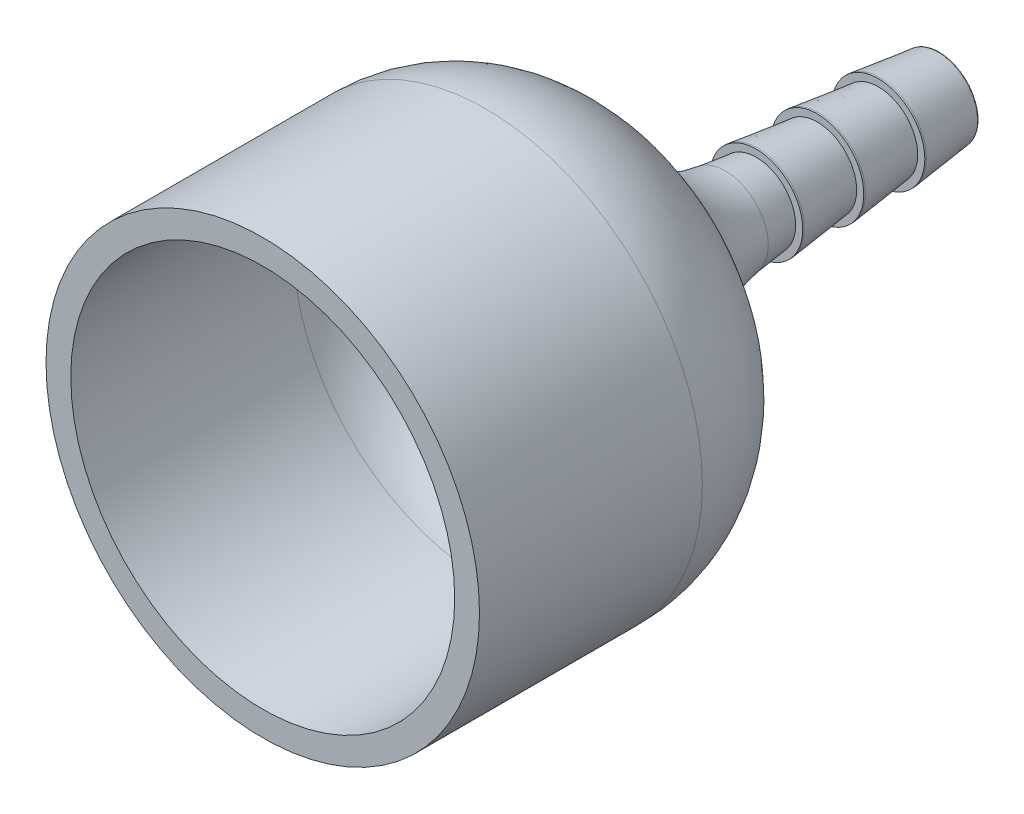
ISO-10303-21;
HEADER;
FILE_DESCRIPTION(('STEP AP214'),'2;1');
FILE_NAME('part.step','',(''),(''),'','','');
FILE_SCHEMA(('AUTOMOTIVE_DESIGN { 1 0 10303 214 1 1 1 1 }'));
ENDSEC;
DATA;
#1=APPLICATION_CONTEXT('core data for automotive mechanical design processes');
#2=APPLICATION_PROTOCOL_DEFINITION('international standard','automotive_design',2000,#1);
#3=PRODUCT_CONTEXT('',#1,'mechanical');
#4=PRODUCT('Part','Part','',(#3));
#5=PRODUCT_RELATED_PRODUCT_CATEGORY('part','',(#4));
#6=PRODUCT_DEFINITION_FORMATION('','',#4);
#7=PRODUCT_DEFINITION_CONTEXT('part definition',#1,'design');
#8=PRODUCT_DEFINITION('design','',#6,#7);
#9=PRODUCT_DEFINITION_SHAPE('','',#8);
#10=(LENGTH_UNIT() NAMED_UNIT(*) SI_UNIT(.MILLI.,.METRE.));
#11=(NAMED_UNIT(*) PLANE_ANGLE_UNIT() SI_UNIT($,.RADIAN.));
#12=(NAMED_UNIT(*) SI_UNIT($,.STERADIAN.) SOLID_ANGLE_UNIT());
#13=UNCERTAINTY_MEASURE_WITH_UNIT(LENGTH_MEASURE(1.E-05),#10,'distance_accuracy_value','');
#14=(GEOMETRIC_REPRESENTATION_CONTEXT(3) GLOBAL_UNCERTAINTY_ASSIGNED_CONTEXT((#13)) GLOBAL_UNIT_ASSIGNED_CONTEXT((#10,
#11,#12)) REPRESENTATION_CONTEXT('',''));
#15=CARTESIAN_POINT('',(0.,0.,0.));
#16=DIRECTION('',(0.,0.,1.));
#17=DIRECTION('',(1.,0.,0.));
#18=AXIS2_PLACEMENT_3D('',#15,#16,#17);
#19=CARTESIAN_POINT('',(0.,0.,-20.7304));
#20=DIRECTION('',(0.,0.,1.));
#21=DIRECTION('',(1.,0.,0.));
#22=AXIS2_PLACEMENT_3D('',#19,#20,#21);
#23=CONICAL_SURFACE('',#22,3.748185925,0.118542781631952);
#24=CARTESIAN_POINT('',(0.,0.,-25.4190130370028));
#25=DIRECTION('',(0.,0.,1.));
#26=DIRECTION('',(1.,0.,0.));
#27=AXIS2_PLACEMENT_3D('',#24,#25,#26);
#28=CIRCLE('',#27,3.18976653061079);
#29=CARTESIAN_POINT('',(3.18976653061079,0.,-25.4190130370028));
#30=VERTEX_POINT('',#29);
#31=EDGE_CURVE('E59',#30,#30,#28,.T.);
#32=ORIENTED_EDGE('',*,*,#31,.T.);
#33=EDGE_LOOP('',(#32));
#34=FACE_BOUND('',#33,.T.);
#35=CARTESIAN_POINT('',(0.,0.,-20.7304));
#36=DIRECTION('',(0.,0.,1.));
#37=DIRECTION('',(1.,0.,0.));
#38=AXIS2_PLACEMENT_3D('',#35,#36,#37);
#39=CIRCLE('',#38,3.748185925);
#40=CARTESIAN_POINT('',(3.748185925,0.,-20.7304));
#41=VERTEX_POINT('',#40);
#42=EDGE_CURVE('E107',#41,#41,#39,.T.);
#43=ORIENTED_EDGE('',*,*,#42,.F.);
#44=EDGE_LOOP('',(#43));
#45=FACE_BOUND('',#44,.T.);
#46=ADVANCED_FACE('F39',(#34,#45),#23,.T.);
#47=CARTESIAN_POINT('',(3.18976653061074,0.,-25.4190130370028));
#48=CARTESIAN_POINT('',(3.18636645890866,0.,-25.4475607928099));
#49=CARTESIAN_POINT('',(3.171391458103,0.,-25.4785311625513));
#50=CARTESIAN_POINT('',(3.12290905073233,0.,-25.5208290056172));
#51=CARTESIAN_POINT('',(3.09109606153185,0.,-25.531));
#52=CARTESIAN_POINT('',(3.06360027050815,0.,-25.531));
#53=B_SPLINE_CURVE_WITH_KNOTS('',3,(#47,#48,#49,#50,#51,#52),.UNSPECIFIED.,.F.,.F.,(4,2,4),(0.,
0.5,1.),.UNSPECIFIED.);
#54=CARTESIAN_POINT('',(0.,0.,-25.781));
#55=DIRECTION('',(0.,0.,1.));
#56=AXIS1_PLACEMENT('',#54,#55);
#57=SURFACE_OF_REVOLUTION('',#53,#56);
#58=CARTESIAN_POINT('',(0.,0.,-25.531));
#59=DIRECTION('',(0.,0.,1.));
#60=DIRECTION('',(1.,0.,0.));
#61=AXIS2_PLACEMENT_3D('',#58,#59,#60);
#62=CIRCLE('',#61,3.06360027050815);
#63=CARTESIAN_POINT('',(3.06360027050815,0.,-25.531));
#64=VERTEX_POINT('',#63);
#65=EDGE_CURVE('E62',#64,#64,#62,.T.);
#66=ORIENTED_EDGE('',*,*,#65,.T.);
#67=EDGE_LOOP('',(#66));
#68=FACE_BOUND('',#67,.T.);
#69=ORIENTED_EDGE('',*,*,#31,.F.);
#70=EDGE_LOOP('',(#69));
#71=FACE_BOUND('',#70,.T.);
#72=ADVANCED_FACE('F117',(#68,#71),#57,.F.);
#73=CARTESIAN_POINT('',(1.08726742428337E-13,0.,-25.531));
#74=DIRECTION('',(0.,0.,-1.));
#75=DIRECTION('',(-1.,0.,0.));
#76=AXIS2_PLACEMENT_3D('',#73,#74,#75);
#77=PLANE('',#76);
#78=CARTESIAN_POINT('',(0.,0.,-25.531));
#79=DIRECTION('',(0.,0.,1.));
#80=DIRECTION('',(1.,0.,0.));
#81=AXIS2_PLACEMENT_3D('',#78,#79,#80);
#82=CIRCLE('',#81,2.248911555);
#83=CARTESIAN_POINT('',(2.248911555,0.,-25.531));
#84=VERTEX_POINT('',#83);
#85=EDGE_CURVE('E65',#84,#84,#82,.T.);
#86=ORIENTED_EDGE('',*,*,#85,.T.);
#87=EDGE_LOOP('',(#86));
#88=FACE_BOUND('',#87,.T.);
#89=ORIENTED_EDGE('',*,*,#65,.F.);
#90=EDGE_LOOP('',(#89));
#91=FACE_BOUND('',#90,.T.);
#92=ADVANCED_FACE('F121',(#88,#91),#77,.T.);
#93=CARTESIAN_POINT('',(0.,0.,-25.781));
#94=DIRECTION('',(0.,0.,1.));
#95=DIRECTION('',(1.,0.,0.));
#96=AXIS2_PLACEMENT_3D('',#93,#94,#95);
#97=CYLINDRICAL_SURFACE('',#96,2.248911555);
#98=CARTESIAN_POINT('',(0.,0.,0.106999999999999));
#99=DIRECTION('',(0.,0.,1.));
#100=DIRECTION('',(1.,0.,0.));
#101=AXIS2_PLACEMENT_3D('',#98,#99,#100);
#102=CIRCLE('',#101,2.248911555);
#103=CARTESIAN_POINT('',(2.248911555,0.,0.106999999999999));
#104=VERTEX_POINT('',#103);
#105=EDGE_CURVE('E46',#104,#104,#102,.T.);
#106=ORIENTED_EDGE('',*,*,#105,.T.);
#107=EDGE_LOOP('',(#106));
#108=FACE_BOUND('',#107,.T.);
#109=ORIENTED_EDGE('',*,*,#85,.F.);
#110=EDGE_LOOP('',(#109));
#111=FACE_BOUND('',#110,.T.);
#112=ADVANCED_FACE('F172',(#108,#111),#97,.F.);
#113=CARTESIAN_POINT('',(0.,0.,1.107));
#114=DIRECTION('',(0.,0.,1.));
#115=DIRECTION('',(1.,0.,0.));
#116=AXIS2_PLACEMENT_3D('',#113,#114,#115);
#117=PLANE('',#116);
#118=CARTESIAN_POINT('',(0.,0.,1.107));
#119=DIRECTION('',(0.,0.,1.));
#120=DIRECTION('',(1.,0.,0.));
#121=AXIS2_PLACEMENT_3D('',#118,#119,#120);
#122=CIRCLE('',#121,3.248911555);
#123=CARTESIAN_POINT('',(3.248911555,0.,1.107));
#124=VERTEX_POINT('',#123);
#125=EDGE_CURVE('E10',#124,#124,#122,.F.);
#126=ORIENTED_EDGE('',*,*,#125,.T.);
#127=EDGE_LOOP('',(#126));
#128=FACE_BOUND('',#127,.T.);
#129=CARTESIAN_POINT('',(0.,0.,1.107));
#130=DIRECTION('',(0.,0.,1.));
#131=DIRECTION('',(1.,0.,0.));
#132=AXIS2_PLACEMENT_3D('',#129,#130,#131);
#133=CIRCLE('',#132,5.5);
#134=CARTESIAN_POINT('',(5.5,0.,1.107));
#135=VERTEX_POINT('',#134);
#136=EDGE_CURVE('E68',#135,#135,#133,.T.);
#137=ORIENTED_EDGE('',*,*,#136,.T.);
#138=EDGE_LOOP('',(#137));
#139=FACE_BOUND('',#138,.T.);
#140=ADVANCED_FACE('F169',(#128,#139),#117,.T.);
#141=CARTESIAN_POINT('',(0.,0.,11.107));
#142=DIRECTION('',(0.,0.,1.));
#143=DIRECTION('',(1.,0.,0.));
#144=AXIS2_PLACEMENT_3D('',#141,#142,#143);
#145=DEGENERATE_TOROIDAL_SURFACE('',#144,5.5,10.,.T.);
#146=CARTESIAN_POINT('',(0.,0.,11.107));
#147=DIRECTION('',(0.,0.,1.));
#148=DIRECTION('',(1.,0.,0.));
#149=AXIS2_PLACEMENT_3D('',#146,#147,#148);
#150=CIRCLE('',#149,15.5);
#151=CARTESIAN_POINT('',(15.5,0.,11.107));
#152=VERTEX_POINT('',#151);
#153=EDGE_CURVE('E71',#152,#152,#150,.T.);
#154=ORIENTED_EDGE('',*,*,#153,.T.);
#155=EDGE_LOOP('',(#154));
#156=FACE_BOUND('',#155,.T.);
#157=ORIENTED_EDGE('',*,*,#136,.F.);
#158=EDGE_LOOP('',(#157));
#159=FACE_BOUND('',#158,.T.);
#160=ADVANCED_FACE('F165',(#156,#159),#145,.F.);
#161=CARTESIAN_POINT('',(0.,0.,-25.781));
#162=DIRECTION('',(0.,0.,1.));
#163=DIRECTION('',(1.,0.,0.));
#164=AXIS2_PLACEMENT_3D('',#161,#162,#163);
#165=CYLINDRICAL_SURFACE('',#164,15.5);
#166=CARTESIAN_POINT('',(0.,0.,29.1028330439413));
#167=DIRECTION('',(0.,0.,1.));
#168=DIRECTION('',(1.,0.,0.));
#169=AXIS2_PLACEMENT_3D('',#166,#167,#168);
#170=CIRCLE('',#169,15.5);
#171=CARTESIAN_POINT('',(15.5,0.,29.1028330439413));
#172=VERTEX_POINT('',#171);
#173=EDGE_CURVE('E74',#172,#172,#170,.T.);
#174=ORIENTED_EDGE('',*,*,#173,.T.);
#175=EDGE_LOOP('',(#174));
#176=FACE_BOUND('',#175,.T.);
#177=ORIENTED_EDGE('',*,*,#153,.F.);
#178=EDGE_LOOP('',(#177));
#179=FACE_BOUND('',#178,.T.);
#180=ADVANCED_FACE('F157',(#176,#179),#165,.F.);
#181=CARTESIAN_POINT('',(0.,0.,29.1028330439413));
#182=DIRECTION('',(0.,0.,-1.));
#183=DIRECTION('',(-1.,0.,0.));
#184=AXIS2_PLACEMENT_3D('',#181,#182,#183);
#185=PLANE('',#184);
#186=ORIENTED_EDGE('',*,*,#173,.F.);
#187=EDGE_LOOP('',(#186));
#188=FACE_BOUND('',#187,.T.);
#189=CARTESIAN_POINT('',(0.,0.,29.1028330439413));
#190=DIRECTION('',(0.,0.,1.));
#191=DIRECTION('',(1.,0.,0.));
#192=AXIS2_PLACEMENT_3D('',#189,#190,#191);
#193=CIRCLE('',#192,17.5);
#194=CARTESIAN_POINT('',(17.5,0.,29.1028330439413));
#195=VERTEX_POINT('',#194);
#196=EDGE_CURVE('E77',#195,#195,#193,.T.);
#197=ORIENTED_EDGE('',*,*,#196,.T.);
#198=EDGE_LOOP('',(#197));
#199=FACE_BOUND('',#198,.T.);
#200=ADVANCED_FACE('F151',(#188,#199),#185,.F.);
#201=CARTESIAN_POINT('',(0.,0.,-25.781));
#202=DIRECTION('',(0.,0.,1.));
#203=DIRECTION('',(1.,0.,0.));
#204=AXIS2_PLACEMENT_3D('',#201,#202,#203);
#205=CYLINDRICAL_SURFACE('',#204,17.5);
#206=ORIENTED_EDGE('',*,*,#196,.F.);
#207=EDGE_LOOP('',(#206));
#208=FACE_BOUND('',#207,.T.);
#209=CARTESIAN_POINT('',(0.,0.,11.107));
#210=DIRECTION('',(0.,0.,1.));
#211=DIRECTION('',(1.,0.,0.));
#212=AXIS2_PLACEMENT_3D('',#209,#210,#211);
#213=CIRCLE('',#212,17.5);
#214=CARTESIAN_POINT('',(17.5,0.,11.107));
#215=VERTEX_POINT('',#214);
#216=EDGE_CURVE('E80',#215,#215,#213,.T.);
#217=ORIENTED_EDGE('',*,*,#216,.T.);
#218=EDGE_LOOP('',(#217));
#219=FACE_BOUND('',#218,.T.);
#220=ADVANCED_FACE('F146',(#208,#219),#205,.T.);
#221=CARTESIAN_POINT('',(0.,0.,11.107));
#222=DIRECTION('',(0.,0.,1.));
#223=DIRECTION('',(1.,0.,0.));
#224=AXIS2_PLACEMENT_3D('',#221,#222,#223);
#225=DEGENERATE_TOROIDAL_SURFACE('',#224,5.5,12.,.T.);
#226=CARTESIAN_POINT('',(0.,0.,-0.0916143256833625));
#227=DIRECTION('',(0.,0.,1.));
#228=DIRECTION('',(1.,0.,0.));
#229=AXIS2_PLACEMENT_3D('',#226,#227,#228);
#230=CIRCLE('',#229,9.81173250383179);
#231=CARTESIAN_POINT('',(9.81173250383179,0.,-0.0916143256833625));
#232=VERTEX_POINT('',#231);
#233=EDGE_CURVE('E54',#232,#232,#230,.T.);
#234=ORIENTED_EDGE('',*,*,#233,.T.);
#235=EDGE_LOOP('',(#234));
#236=FACE_BOUND('',#235,.T.);
#237=ORIENTED_EDGE('',*,*,#216,.F.);
#238=EDGE_LOOP('',(#237));
#239=FACE_BOUND('',#238,.T.);
#240=ADVANCED_FACE('F142',(#236,#239),#225,.T.);
#241=CARTESIAN_POINT('',(0.,0.,-0.893000000000001));
#242=DIRECTION('',(0.,0.,1.));
#243=DIRECTION('',(1.,0.,0.));
#244=AXIS2_PLACEMENT_3D('',#241,#242,#243);
#245=CONICAL_SURFACE('',#244,4.35019480238095,0.118542781631955);
#246=CARTESIAN_POINT('',(0.,0.,-8.24113951324666));
#247=DIRECTION('',(0.,0.,1.));
#248=DIRECTION('',(1.,0.,0.));
#249=AXIS2_PLACEMENT_3D('',#246,#247,#248);
#250=CIRCLE('',#249,3.47502263856814);
#251=CARTESIAN_POINT('',(3.47502263856814,0.,-8.24113951324666));
#252=VERTEX_POINT('',#251);
#253=EDGE_CURVE('E50',#252,#252,#250,.F.);
#254=ORIENTED_EDGE('',*,*,#253,.T.);
#255=EDGE_LOOP('',(#254));
#256=FACE_BOUND('',#255,.T.);
#257=CARTESIAN_POINT('',(0.,0.,-10.7482));
#258=DIRECTION('',(0.,0.,1.));
#259=DIRECTION('',(1.,0.,0.));
#260=AXIS2_PLACEMENT_3D('',#257,#258,#259);
#261=CIRCLE('',#260,3.17642875);
#262=CARTESIAN_POINT('',(3.17642875,0.,-10.7482));
#263=VERTEX_POINT('',#262);
#264=EDGE_CURVE('E83',#263,#263,#261,.T.);
#265=ORIENTED_EDGE('',*,*,#264,.T.);
#266=EDGE_LOOP('',(#265));
#267=FACE_BOUND('',#266,.T.);
#268=ADVANCED_FACE('F145',(#256,#267),#245,.T.);
#269=CARTESIAN_POINT('',(0.,0.,-10.7482));
#270=DIRECTION('',(0.,0.,1.));
#271=DIRECTION('',(1.,0.,0.));
#272=AXIS2_PLACEMENT_3D('',#269,#270,#271);
#273=PLANE('',#272);
#274=CARTESIAN_POINT('',(0.,0.,-10.7482));
#275=DIRECTION('',(0.,0.,1.));
#276=DIRECTION('',(1.,0.,0.));
#277=AXIS2_PLACEMENT_3D('',#274,#275,#276);
#278=CIRCLE('',#277,3.748185925);
#279=CARTESIAN_POINT('',(3.748185925,0.,-10.7482));
#280=VERTEX_POINT('',#279);
#281=EDGE_CURVE('E86',#280,#280,#278,.T.);
#282=ORIENTED_EDGE('',*,*,#281,.T.);
#283=EDGE_LOOP('',(#282));
#284=FACE_BOUND('',#283,.T.);
#285=ORIENTED_EDGE('',*,*,#264,.F.);
#286=EDGE_LOOP('',(#285));
#287=FACE_BOUND('',#286,.T.);
#288=ADVANCED_FACE('F221',(#284,#287),#273,.T.);
#289=CARTESIAN_POINT('',(0.,0.,-25.781));
#290=DIRECTION('',(0.,0.,1.));
#291=DIRECTION('',(1.,0.,0.));
#292=AXIS2_PLACEMENT_3D('',#289,#290,#291);
#293=CYLINDRICAL_SURFACE('',#292,3.748185925);
#294=CARTESIAN_POINT('',(0.,0.,-10.8752));
#295=DIRECTION('',(0.,0.,1.));
#296=DIRECTION('',(1.,0.,0.));
#297=AXIS2_PLACEMENT_3D('',#294,#295,#296);
#298=CIRCLE('',#297,3.748185925);
#299=CARTESIAN_POINT('',(3.748185925,0.,-10.8752));
#300=VERTEX_POINT('',#299);
#301=EDGE_CURVE('E89',#300,#300,#298,.T.);
#302=ORIENTED_EDGE('',*,*,#301,.T.);
#303=EDGE_LOOP('',(#302));
#304=FACE_BOUND('',#303,.T.);
#305=ORIENTED_EDGE('',*,*,#281,.F.);
#306=EDGE_LOOP('',(#305));
#307=FACE_BOUND('',#306,.T.);
#308=ADVANCED_FACE('F215',(#304,#307),#293,.T.);
#309=CARTESIAN_POINT('',(0.,0.,-10.8752));
#310=DIRECTION('',(0.,0.,1.));
#311=DIRECTION('',(1.,0.,0.));
#312=AXIS2_PLACEMENT_3D('',#309,#310,#311);
#313=CONICAL_SURFACE('',#312,3.748185925,0.118542781631955);
#314=CARTESIAN_POINT('',(0.,0.,-15.6758));
#315=DIRECTION('',(0.,0.,1.));
#316=DIRECTION('',(1.,0.,0.));
#317=AXIS2_PLACEMENT_3D('',#314,#315,#316);
#318=CIRCLE('',#317,3.17642875);
#319=CARTESIAN_POINT('',(3.17642875,0.,-15.6758));
#320=VERTEX_POINT('',#319);
#321=EDGE_CURVE('E92',#320,#320,#318,.T.);
#322=ORIENTED_EDGE('',*,*,#321,.T.);
#323=EDGE_LOOP('',(#322));
#324=FACE_BOUND('',#323,.T.);
#325=ORIENTED_EDGE('',*,*,#301,.F.);
#326=EDGE_LOOP('',(#325));
#327=FACE_BOUND('',#326,.T.);
#328=ADVANCED_FACE('F209',(#324,#327),#313,.T.);
#329=CARTESIAN_POINT('',(0.,0.,-15.6758));
#330=DIRECTION('',(0.,0.,1.));
#331=DIRECTION('',(1.,0.,0.));
#332=AXIS2_PLACEMENT_3D('',#329,#330,#331);
#333=PLANE('',#332);
#334=CARTESIAN_POINT('',(0.,0.,-15.6758));
#335=DIRECTION('',(0.,0.,1.));
#336=DIRECTION('',(1.,0.,0.));
#337=AXIS2_PLACEMENT_3D('',#334,#335,#336);
#338=CIRCLE('',#337,3.748185925);
#339=CARTESIAN_POINT('',(3.748185925,0.,-15.6758));
#340=VERTEX_POINT('',#339);
#341=EDGE_CURVE('E95',#340,#340,#338,.T.);
#342=ORIENTED_EDGE('',*,*,#341,.T.);
#343=EDGE_LOOP('',(#342));
#344=FACE_BOUND('',#343,.T.);
#345=ORIENTED_EDGE('',*,*,#321,.F.);
#346=EDGE_LOOP('',(#345));
#347=FACE_BOUND('',#346,.T.);
#348=ADVANCED_FACE('F203',(#344,#347),#333,.T.);
#349=CARTESIAN_POINT('',(0.,0.,-25.781));
#350=DIRECTION('',(0.,0.,1.));
#351=DIRECTION('',(1.,0.,0.));
#352=AXIS2_PLACEMENT_3D('',#349,#350,#351);
#353=CYLINDRICAL_SURFACE('',#352,3.748185925);
#354=CARTESIAN_POINT('',(0.,0.,-15.8028));
#355=DIRECTION('',(0.,0.,1.));
#356=DIRECTION('',(1.,0.,0.));
#357=AXIS2_PLACEMENT_3D('',#354,#355,#356);
#358=CIRCLE('',#357,3.748185925);
#359=CARTESIAN_POINT('',(3.748185925,0.,-15.8028));
#360=VERTEX_POINT('',#359);
#361=EDGE_CURVE('E98',#360,#360,#358,.T.);
#362=ORIENTED_EDGE('',*,*,#361,.T.);
#363=EDGE_LOOP('',(#362));
#364=FACE_BOUND('',#363,.T.);
#365=ORIENTED_EDGE('',*,*,#341,.F.);
#366=EDGE_LOOP('',(#365));
#367=FACE_BOUND('',#366,.T.);
#368=ADVANCED_FACE('F197',(#364,#367),#353,.T.);
#369=CARTESIAN_POINT('',(0.,0.,-15.8028));
#370=DIRECTION('',(0.,0.,1.));
#371=DIRECTION('',(1.,0.,0.));
#372=AXIS2_PLACEMENT_3D('',#369,#370,#371);
#373=CONICAL_SURFACE('',#372,3.748185925,0.118542781631955);
#374=CARTESIAN_POINT('',(0.,0.,-20.6034));
#375=DIRECTION('',(0.,0.,1.));
#376=DIRECTION('',(1.,0.,0.));
#377=AXIS2_PLACEMENT_3D('',#374,#375,#376);
#378=CIRCLE('',#377,3.17642875);
#379=CARTESIAN_POINT('',(3.17642875,0.,-20.6034));
#380=VERTEX_POINT('',#379);
#381=EDGE_CURVE('E101',#380,#380,#378,.T.);
#382=ORIENTED_EDGE('',*,*,#381,.T.);
#383=EDGE_LOOP('',(#382));
#384=FACE_BOUND('',#383,.T.);
#385=ORIENTED_EDGE('',*,*,#361,.F.);
#386=EDGE_LOOP('',(#385));
#387=FACE_BOUND('',#386,.T.);
#388=ADVANCED_FACE('F191',(#384,#387),#373,.T.);
#389=CARTESIAN_POINT('',(0.,0.,-20.6034));
#390=DIRECTION('',(0.,0.,1.));
#391=DIRECTION('',(1.,0.,0.));
#392=AXIS2_PLACEMENT_3D('',#389,#390,#391);
#393=PLANE('',#392);
#394=CARTESIAN_POINT('',(0.,0.,-20.6034));
#395=DIRECTION('',(0.,0.,1.));
#396=DIRECTION('',(1.,0.,0.));
#397=AXIS2_PLACEMENT_3D('',#394,#395,#396);
#398=CIRCLE('',#397,3.748185925);
#399=CARTESIAN_POINT('',(3.748185925,0.,-20.6034));
#400=VERTEX_POINT('',#399);
#401=EDGE_CURVE('E104',#400,#400,#398,.T.);
#402=ORIENTED_EDGE('',*,*,#401,.T.);
#403=EDGE_LOOP('',(#402));
#404=FACE_BOUND('',#403,.T.);
#405=ORIENTED_EDGE('',*,*,#381,.F.);
#406=EDGE_LOOP('',(#405));
#407=FACE_BOUND('',#406,.T.);
#408=ADVANCED_FACE('F135',(#404,#407),#393,.T.);
#409=CARTESIAN_POINT('',(0.,0.,-25.781));
#410=DIRECTION('',(0.,0.,1.));
#411=DIRECTION('',(1.,0.,0.));
#412=AXIS2_PLACEMENT_3D('',#409,#410,#411);
#413=CYLINDRICAL_SURFACE('',#412,3.748185925);
#414=ORIENTED_EDGE('',*,*,#42,.T.);
#415=EDGE_LOOP('',(#414));
#416=FACE_BOUND('',#415,.T.);
#417=ORIENTED_EDGE('',*,*,#401,.F.);
#418=EDGE_LOOP('',(#417));
#419=FACE_BOUND('',#418,.T.);
#420=ADVANCED_FACE('F128',(#416,#419),#413,.T.);
#421=CARTESIAN_POINT('',(0.,0.,-9.42379293041949));
#422=DIRECTION('',(0.,0.,1.));
#423=DIRECTION('',(1.,0.,0.));
#424=AXIS2_PLACEMENT_3D('',#421,#422,#423);
#425=TOROIDAL_SURFACE('',#424,13.4048429236916,10.);
#426=ORIENTED_EDGE('',*,*,#253,.F.);
#427=EDGE_LOOP('',(#426));
#428=FACE_BOUND('',#427,.T.);
#429=ORIENTED_EDGE('',*,*,#233,.F.);
#430=EDGE_LOOP('',(#429));
#431=FACE_BOUND('',#430,.T.);
#432=ADVANCED_FACE('F126',(#428,#431),#425,.F.);
#433=CARTESIAN_POINT('',(0.,0.,0.106999999999999));
#434=DIRECTION('',(0.,0.,1.));
#435=DIRECTION('',(1.,0.,0.));
#436=AXIS2_PLACEMENT_3D('',#433,#434,#435);
#437=TOROIDAL_SURFACE('',#436,3.248911555,1.);
#438=ORIENTED_EDGE('',*,*,#125,.F.);
#439=EDGE_LOOP('',(#438));
#440=FACE_BOUND('',#439,.T.);
#441=ORIENTED_EDGE('',*,*,#105,.F.);
#442=EDGE_LOOP('',(#441));
#443=FACE_BOUND('',#442,.T.);
#444=ADVANCED_FACE('F41',(#440,#443),#437,.T.);
#445=CLOSED_SHELL('',(#46,#72,#92,#112,#140,#160,#180,#200,#220,#240,#268,#288,#308,#328,#348,
#368,#388,#408,#420,#432,#444));
#446=MANIFOLD_SOLID_BREP('B2',#445);
#447=ADVANCED_BREP_SHAPE_REPRESENTATION('',(#18,#446),#14);
#448=SHAPE_DEFINITION_REPRESENTATION(#9,#447);
ENDSEC;
END-ISO-10303-21;
